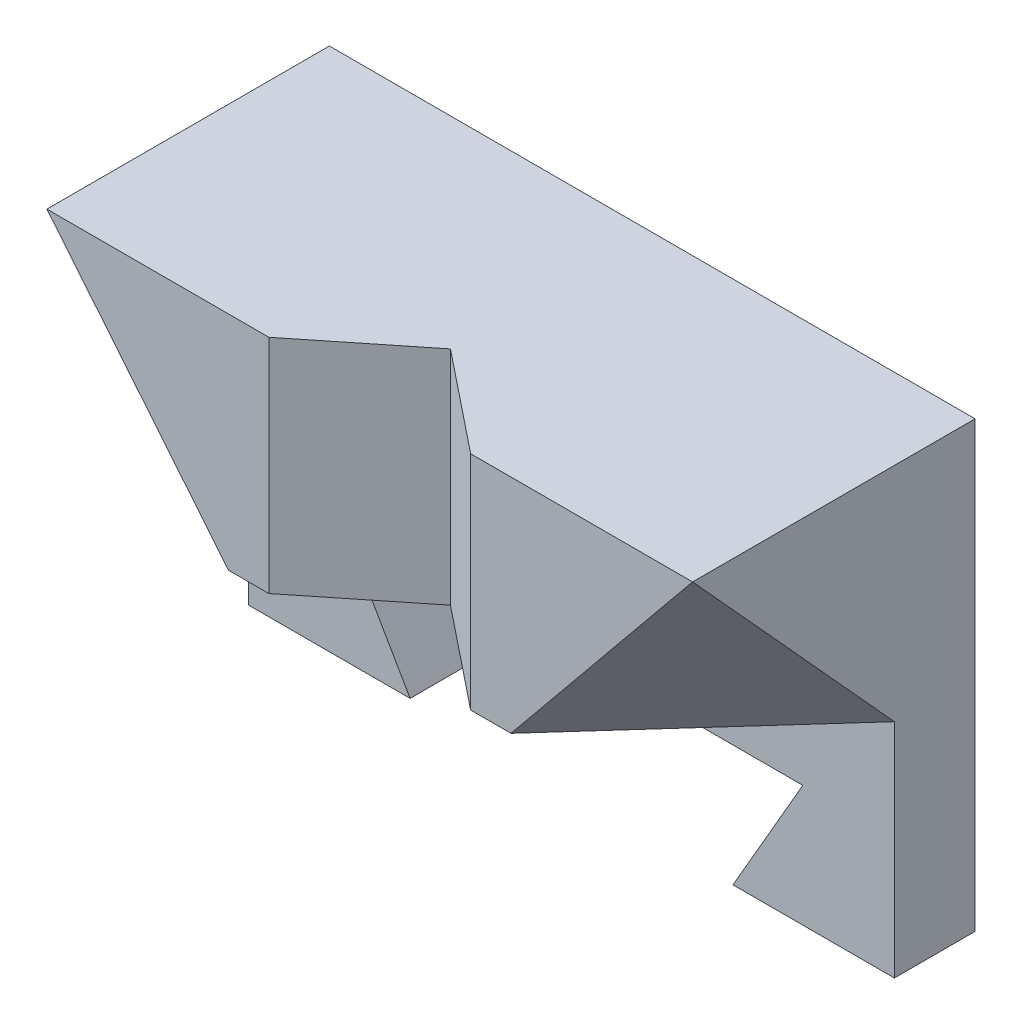
ISO-10303-21;
HEADER;
FILE_DESCRIPTION(('STEP AP214'),'2;1');
FILE_NAME('part.step','',(''),(''),'','','');
FILE_SCHEMA(('AUTOMOTIVE_DESIGN { 1 0 10303 214 1 1 1 1 }'));
ENDSEC;
DATA;
#1=APPLICATION_CONTEXT('core data for automotive mechanical design processes');
#2=APPLICATION_PROTOCOL_DEFINITION('international standard','automotive_design',2000,#1);
#3=PRODUCT_CONTEXT('',#1,'mechanical');
#4=PRODUCT('Part','Part','',(#3));
#5=PRODUCT_RELATED_PRODUCT_CATEGORY('part','',(#4));
#6=PRODUCT_DEFINITION_FORMATION('','',#4);
#7=PRODUCT_DEFINITION_CONTEXT('part definition',#1,'design');
#8=PRODUCT_DEFINITION('design','',#6,#7);
#9=PRODUCT_DEFINITION_SHAPE('','',#8);
#10=(LENGTH_UNIT() NAMED_UNIT(*) SI_UNIT(.MILLI.,.METRE.));
#11=(NAMED_UNIT(*) PLANE_ANGLE_UNIT() SI_UNIT($,.RADIAN.));
#12=(NAMED_UNIT(*) SI_UNIT($,.STERADIAN.) SOLID_ANGLE_UNIT());
#13=UNCERTAINTY_MEASURE_WITH_UNIT(LENGTH_MEASURE(1.E-05),#10,'distance_accuracy_value','');
#14=(GEOMETRIC_REPRESENTATION_CONTEXT(3) GLOBAL_UNCERTAINTY_ASSIGNED_CONTEXT((#13)) GLOBAL_UNIT_ASSIGNED_CONTEXT((#10,
#11,#12)) REPRESENTATION_CONTEXT('',''));
#15=CARTESIAN_POINT('',(0.,0.,0.));
#16=DIRECTION('',(0.,0.,1.));
#17=DIRECTION('',(1.,0.,0.));
#18=AXIS2_PLACEMENT_3D('',#15,#16,#17);
#19=CARTESIAN_POINT('',(0.,0.,20.));
#20=DIRECTION('',(0.,1.,0.));
#21=DIRECTION('',(-1.,0.,0.));
#22=AXIS2_PLACEMENT_3D('',#19,#20,#21);
#23=PLANE('',#22);
#24=DIRECTION('',(0.668964731622449,0.,-0.743294146247166));
#25=VECTOR('',#24,1.);
#26=CARTESIAN_POINT('',(7.73480662983426,0.,26.9613259668508));
#27=LINE('',#26,#25);
#28=CARTESIAN_POINT('',(14.,0.,20.));
#29=VERTEX_POINT('',#28);
#30=CARTESIAN_POINT('',(32.,0.,0.));
#31=VERTEX_POINT('',#30);
#32=EDGE_CURVE('E141',#29,#31,#27,.T.);
#33=ORIENTED_EDGE('',*,*,#32,.F.);
#34=DIRECTION('',(1.,0.,0.));
#35=VECTOR('',#34,1.);
#36=CARTESIAN_POINT('',(32.,0.,20.));
#37=LINE('',#36,#35);
#38=CARTESIAN_POINT('',(10.,0.,20.));
#39=VERTEX_POINT('',#38);
#40=EDGE_CURVE('E155',#39,#29,#37,.T.);
#41=ORIENTED_EDGE('',*,*,#40,.F.);
#42=DIRECTION('',(0.78086880944303,0.,0.624695047554424));
#43=VECTOR('',#42,1.);
#44=CARTESIAN_POINT('',(0.,0.,12.));
#45=LINE('',#44,#43);
#46=CARTESIAN_POINT('',(0.,0.,12.));
#47=VERTEX_POINT('',#46);
#48=EDGE_CURVE('E213',#47,#39,#45,.T.);
#49=ORIENTED_EDGE('',*,*,#48,.F.);
#50=DIRECTION('',(0.78086880944303,0.,-0.624695047554424));
#51=VECTOR('',#50,1.);
#52=CARTESIAN_POINT('',(-10.,0.,20.));
#53=LINE('',#52,#51);
#54=CARTESIAN_POINT('',(-10.,0.,20.));
#55=VERTEX_POINT('',#54);
#56=EDGE_CURVE('E220',#55,#47,#53,.T.);
#57=ORIENTED_EDGE('',*,*,#56,.F.);
#58=CARTESIAN_POINT('',(-14.,0.,20.));
#59=VERTEX_POINT('',#58);
#60=EDGE_CURVE('E178',#59,#55,#37,.T.);
#61=ORIENTED_EDGE('',*,*,#60,.F.);
#62=DIRECTION('',(0.66896473162245,0.,0.743294146247166));
#63=VECTOR('',#62,1.);
#64=CARTESIAN_POINT('',(-7.73480662983426,0.,26.9613259668508));
#65=LINE('',#64,#63);
#66=CARTESIAN_POINT('',(-32.,0.,0.));
#67=VERTEX_POINT('',#66);
#68=EDGE_CURVE('E55',#67,#59,#65,.T.);
#69=ORIENTED_EDGE('',*,*,#68,.F.);
#70=DIRECTION('',(1.,0.,0.));
#71=VECTOR('',#70,1.);
#72=CARTESIAN_POINT('',(0.,0.,0.));
#73=LINE('',#72,#71);
#74=EDGE_CURVE('E182',#67,#31,#73,.T.);
#75=ORIENTED_EDGE('',*,*,#74,.T.);
#76=EDGE_LOOP('',(#33,#41,#49,#57,#61,#69,#75));
#77=FACE_BOUND('',#76,.T.);
#78=ADVANCED_FACE('F41',(#77),#23,.F.);
#79=CARTESIAN_POINT('',(0.,0.,20.));
#80=DIRECTION('',(0.,0.,-1.));
#81=DIRECTION('',(-1.,0.,0.));
#82=AXIS2_PLACEMENT_3D('',#79,#80,#81);
#83=PLANE('',#82);
#84=DIRECTION('',(-0.633237790257263,-0.773957299203321,0.));
#85=VECTOR('',#84,1.);
#86=CARTESIAN_POINT('',(39.5817176996388,31.2665438551141,20.));
#87=LINE('',#86,#85);
#88=CARTESIAN_POINT('',(32.,22.,20.));
#89=VERTEX_POINT('',#88);
#90=EDGE_CURVE('E139',#89,#29,#87,.T.);
#91=ORIENTED_EDGE('',*,*,#90,.F.);
#92=DIRECTION('',(-1.,0.,0.));
#93=VECTOR('',#92,1.);
#94=CARTESIAN_POINT('',(-32.,22.,20.));
#95=LINE('',#94,#93);
#96=CARTESIAN_POINT('',(10.,22.,20.));
#97=VERTEX_POINT('',#96);
#98=EDGE_CURVE('E153',#89,#97,#95,.T.);
#99=ORIENTED_EDGE('',*,*,#98,.T.);
#100=DIRECTION('',(0.,-1.,0.));
#101=VECTOR('',#100,1.);
#102=CARTESIAN_POINT('',(10.,0.,20.));
#103=LINE('',#102,#101);
#104=EDGE_CURVE('E49',#97,#39,#103,.T.);
#105=ORIENTED_EDGE('',*,*,#104,.T.);
#106=ORIENTED_EDGE('',*,*,#40,.T.);
#107=EDGE_LOOP('',(#91,#99,#105,#106));
#108=FACE_BOUND('',#107,.T.);
#109=ADVANCED_FACE('F150',(#108),#83,.F.);
#110=CARTESIAN_POINT('',(32.,-22.,-8.));
#111=DIRECTION('',(1.,0.,0.));
#112=DIRECTION('',(0.,0.,-1.));
#113=AXIS2_PLACEMENT_3D('',#110,#111,#112);
#114=PLANE('',#113);
#115=DIRECTION('',(0.,0.,1.));
#116=VECTOR('',#115,1.);
#117=CARTESIAN_POINT('',(32.,22.,-8.));
#118=LINE('',#117,#116);
#119=CARTESIAN_POINT('',(32.,22.,-8.));
#120=VERTEX_POINT('',#119);
#121=EDGE_CURVE('E158',#120,#89,#118,.T.);
#122=ORIENTED_EDGE('',*,*,#121,.T.);
#123=DIRECTION('',(0.,-0.739940073395944,-0.672672793996313));
#124=VECTOR('',#123,1.);
#125=CARTESIAN_POINT('',(32.,-16.027149321267,-14.5701357466063));
#126=LINE('',#125,#124);
#127=EDGE_CURVE('E136',#89,#31,#126,.T.);
#128=ORIENTED_EDGE('',*,*,#127,.T.);
#129=DIRECTION('',(0.,1.,0.));
#130=VECTOR('',#129,1.);
#131=CARTESIAN_POINT('',(32.,-22.,0.));
#132=LINE('',#131,#130);
#133=CARTESIAN_POINT('',(32.,-22.,0.));
#134=VERTEX_POINT('',#133);
#135=EDGE_CURVE('E190',#134,#31,#132,.T.);
#136=ORIENTED_EDGE('',*,*,#135,.F.);
#137=DIRECTION('',(0.,0.,1.));
#138=VECTOR('',#137,1.);
#139=CARTESIAN_POINT('',(32.,-22.,-8.));
#140=LINE('',#139,#138);
#141=CARTESIAN_POINT('',(32.,-22.,-8.));
#142=VERTEX_POINT('',#141);
#143=EDGE_CURVE('E167',#142,#134,#140,.T.);
#144=ORIENTED_EDGE('',*,*,#143,.F.);
#145=DIRECTION('',(0.,1.,0.));
#146=VECTOR('',#145,1.);
#147=CARTESIAN_POINT('',(32.,-22.,-8.));
#148=LINE('',#147,#146);
#149=EDGE_CURVE('E162',#142,#120,#148,.T.);
#150=ORIENTED_EDGE('',*,*,#149,.T.);
#151=EDGE_LOOP('',(#122,#128,#136,#144,#150));
#152=FACE_BOUND('',#151,.T.);
#153=ADVANCED_FACE('F159',(#152),#114,.T.);
#154=CARTESIAN_POINT('',(-32.,-22.,-8.));
#155=DIRECTION('',(-1.,0.,0.));
#156=DIRECTION('',(0.,0.,1.));
#157=AXIS2_PLACEMENT_3D('',#154,#155,#156);
#158=PLANE('',#157);
#159=DIRECTION('',(0.,-1.,0.));
#160=VECTOR('',#159,1.);
#161=CARTESIAN_POINT('',(-32.,-22.,0.));
#162=LINE('',#161,#160);
#163=CARTESIAN_POINT('',(-32.,-22.,0.));
#164=VERTEX_POINT('',#163);
#165=EDGE_CURVE('E172',#67,#164,#162,.T.);
#166=ORIENTED_EDGE('',*,*,#165,.F.);
#167=DIRECTION('',(0.,0.739940073395944,0.672672793996313));
#168=VECTOR('',#167,1.);
#169=CARTESIAN_POINT('',(-32.,-16.027149321267,-14.5701357466063));
#170=LINE('',#169,#168);
#171=CARTESIAN_POINT('',(-32.,22.,20.));
#172=VERTEX_POINT('',#171);
#173=EDGE_CURVE('E221',#67,#172,#170,.T.);
#174=ORIENTED_EDGE('',*,*,#173,.T.);
#175=DIRECTION('',(0.,0.,1.));
#176=VECTOR('',#175,1.);
#177=CARTESIAN_POINT('',(-32.,22.,-8.));
#178=LINE('',#177,#176);
#179=CARTESIAN_POINT('',(-32.,22.,-8.));
#180=VERTEX_POINT('',#179);
#181=EDGE_CURVE('E166',#180,#172,#178,.T.);
#182=ORIENTED_EDGE('',*,*,#181,.F.);
#183=DIRECTION('',(0.,-1.,0.));
#184=VECTOR('',#183,1.);
#185=CARTESIAN_POINT('',(-32.,-22.,-8.));
#186=LINE('',#185,#184);
#187=CARTESIAN_POINT('',(-32.,-22.,-8.));
#188=VERTEX_POINT('',#187);
#189=EDGE_CURVE('E186',#180,#188,#186,.T.);
#190=ORIENTED_EDGE('',*,*,#189,.T.);
#191=DIRECTION('',(0.,0.,1.));
#192=VECTOR('',#191,1.);
#193=CARTESIAN_POINT('',(-32.,-22.,-8.));
#194=LINE('',#193,#192);
#195=EDGE_CURVE('E196',#188,#164,#194,.T.);
#196=ORIENTED_EDGE('',*,*,#195,.T.);
#197=EDGE_LOOP('',(#166,#174,#182,#190,#196));
#198=FACE_BOUND('',#197,.T.);
#199=ADVANCED_FACE('F43',(#198),#158,.T.);
#200=DIRECTION('',(-0.633237790257263,0.773957299203321,0.));
#201=VECTOR('',#200,1.);
#202=CARTESIAN_POINT('',(-8.38613861386139,-6.86138613861386,20.));
#203=LINE('',#202,#201);
#204=EDGE_CURVE('E11',#59,#172,#203,.T.);
#205=ORIENTED_EDGE('',*,*,#204,.F.);
#206=ORIENTED_EDGE('',*,*,#60,.T.);
#207=DIRECTION('',(0.,1.,0.));
#208=VECTOR('',#207,1.);
#209=CARTESIAN_POINT('',(-10.,0.,20.));
#210=LINE('',#209,#208);
#211=CARTESIAN_POINT('',(-10.,22.,20.));
#212=VERTEX_POINT('',#211);
#213=EDGE_CURVE('E203',#55,#212,#210,.T.);
#214=ORIENTED_EDGE('',*,*,#213,.T.);
#215=EDGE_CURVE('E173',#212,#172,#95,.T.);
#216=ORIENTED_EDGE('',*,*,#215,.T.);
#217=EDGE_LOOP('',(#205,#206,#214,#216));
#218=FACE_BOUND('',#217,.T.);
#219=ADVANCED_FACE('F216',(#218),#83,.F.);
#220=CARTESIAN_POINT('',(32.,-22.,-8.));
#221=DIRECTION('',(0.,-1.,0.));
#222=DIRECTION('',(1.,0.,0.));
#223=AXIS2_PLACEMENT_3D('',#220,#221,#222);
#224=PLANE('',#223);
#225=DIRECTION('',(0.,0.,1.));
#226=VECTOR('',#225,1.);
#227=CARTESIAN_POINT('',(-16.,-22.,-20.));
#228=LINE('',#227,#226);
#229=CARTESIAN_POINT('',(-16.,-22.,-8.));
#230=VERTEX_POINT('',#229);
#231=CARTESIAN_POINT('',(-16.,-22.,0.));
#232=VERTEX_POINT('',#231);
#233=EDGE_CURVE('E240',#230,#232,#228,.T.);
#234=ORIENTED_EDGE('',*,*,#233,.T.);
#235=DIRECTION('',(1.,0.,0.));
#236=VECTOR('',#235,1.);
#237=CARTESIAN_POINT('',(32.,-22.,0.));
#238=LINE('',#237,#236);
#239=EDGE_CURVE('E198',#164,#232,#238,.T.);
#240=ORIENTED_EDGE('',*,*,#239,.F.);
#241=ORIENTED_EDGE('',*,*,#195,.F.);
#242=DIRECTION('',(1.,0.,0.));
#243=VECTOR('',#242,1.);
#244=CARTESIAN_POINT('',(32.,-22.,-8.));
#245=LINE('',#244,#243);
#246=EDGE_CURVE('E191',#188,#230,#245,.T.);
#247=ORIENTED_EDGE('',*,*,#246,.T.);
#248=EDGE_LOOP('',(#234,#240,#241,#247));
#249=FACE_BOUND('',#248,.T.);
#250=ADVANCED_FACE('F262',(#249),#224,.T.);
#251=CARTESIAN_POINT('',(32.,22.,-8.));
#252=DIRECTION('',(0.,1.,0.));
#253=DIRECTION('',(-1.,0.,0.));
#254=AXIS2_PLACEMENT_3D('',#251,#252,#253);
#255=PLANE('',#254);
#256=DIRECTION('',(-0.78086880944303,0.,-0.624695047554424));
#257=VECTOR('',#256,1.);
#258=CARTESIAN_POINT('',(9.75609756097562,22.,19.8048780487805));
#259=LINE('',#258,#257);
#260=CARTESIAN_POINT('',(0.,22.,12.));
#261=VERTEX_POINT('',#260);
#262=EDGE_CURVE('E171',#97,#261,#259,.T.);
#263=ORIENTED_EDGE('',*,*,#262,.F.);
#264=ORIENTED_EDGE('',*,*,#98,.F.);
#265=ORIENTED_EDGE('',*,*,#121,.F.);
#266=DIRECTION('',(-1.,0.,0.));
#267=VECTOR('',#266,1.);
#268=CARTESIAN_POINT('',(32.,22.,-8.));
#269=LINE('',#268,#267);
#270=EDGE_CURVE('E195',#120,#180,#269,.T.);
#271=ORIENTED_EDGE('',*,*,#270,.T.);
#272=ORIENTED_EDGE('',*,*,#181,.T.);
#273=ORIENTED_EDGE('',*,*,#215,.F.);
#274=DIRECTION('',(-0.78086880944303,0.,0.624695047554424));
#275=VECTOR('',#274,1.);
#276=CARTESIAN_POINT('',(29.2682926829268,22.,-11.4146341463415));
#277=LINE('',#276,#275);
#278=EDGE_CURVE('E63',#261,#212,#277,.T.);
#279=ORIENTED_EDGE('',*,*,#278,.F.);
#280=EDGE_LOOP('',(#263,#264,#265,#271,#272,#273,#279));
#281=FACE_BOUND('',#280,.T.);
#282=ADVANCED_FACE('F170',(#281),#255,.T.);
#283=DIRECTION('',(0.,0.,1.));
#284=VECTOR('',#283,1.);
#285=CARTESIAN_POINT('',(16.,-22.,-20.));
#286=LINE('',#285,#284);
#287=CARTESIAN_POINT('',(16.,-22.,-8.));
#288=VERTEX_POINT('',#287);
#289=CARTESIAN_POINT('',(16.,-22.,0.));
#290=VERTEX_POINT('',#289);
#291=EDGE_CURVE('E239',#288,#290,#286,.T.);
#292=ORIENTED_EDGE('',*,*,#291,.F.);
#293=EDGE_CURVE('E189',#288,#142,#245,.T.);
#294=ORIENTED_EDGE('',*,*,#293,.T.);
#295=ORIENTED_EDGE('',*,*,#143,.T.);
#296=EDGE_CURVE('E175',#290,#134,#238,.T.);
#297=ORIENTED_EDGE('',*,*,#296,.F.);
#298=EDGE_LOOP('',(#292,#294,#295,#297));
#299=FACE_BOUND('',#298,.T.);
#300=ADVANCED_FACE('F269',(#299),#224,.T.);
#301=CARTESIAN_POINT('',(0.,0.,-8.));
#302=DIRECTION('',(0.,0.,1.));
#303=DIRECTION('',(1.,0.,0.));
#304=AXIS2_PLACEMENT_3D('',#301,#302,#303);
#305=PLANE('',#304);
#306=DIRECTION('',(-1.,0.,0.));
#307=VECTOR('',#306,1.);
#308=CARTESIAN_POINT('',(0.,-10.,-8.));
#309=LINE('',#308,#307);
#310=CARTESIAN_POINT('',(22.9282032302756,-10.,-8.));
#311=VERTEX_POINT('',#310);
#312=CARTESIAN_POINT('',(-22.9282032302756,-10.,-8.));
#313=VERTEX_POINT('',#312);
#314=EDGE_CURVE('E252',#311,#313,#309,.T.);
#315=ORIENTED_EDGE('',*,*,#314,.T.);
#316=DIRECTION('',(0.500000000000004,-0.866025403784436,0.));
#317=VECTOR('',#316,1.);
#318=CARTESIAN_POINT('',(-21.5262794416288,-12.4282032302756,-8.));
#319=LINE('',#318,#317);
#320=EDGE_CURVE('E185',#313,#230,#319,.T.);
#321=ORIENTED_EDGE('',*,*,#320,.T.);
#322=ORIENTED_EDGE('',*,*,#246,.F.);
#323=ORIENTED_EDGE('',*,*,#189,.F.);
#324=ORIENTED_EDGE('',*,*,#270,.F.);
#325=ORIENTED_EDGE('',*,*,#149,.F.);
#326=ORIENTED_EDGE('',*,*,#293,.F.);
#327=DIRECTION('',(0.500000000000005,0.866025403784436,0.));
#328=VECTOR('',#327,1.);
#329=CARTESIAN_POINT('',(21.5262794416288,-12.4282032302757,-8.));
#330=LINE('',#329,#328);
#331=EDGE_CURVE('E243',#288,#311,#330,.T.);
#332=ORIENTED_EDGE('',*,*,#331,.T.);
#333=EDGE_LOOP('',(#315,#321,#322,#323,#324,#325,#326,#332));
#334=FACE_BOUND('',#333,.T.);
#335=ADVANCED_FACE('F257',(#334),#305,.F.);
#336=CARTESIAN_POINT('',(0.,0.,0.));
#337=DIRECTION('',(0.,0.,1.));
#338=DIRECTION('',(1.,0.,0.));
#339=AXIS2_PLACEMENT_3D('',#336,#337,#338);
#340=PLANE('',#339);
#341=DIRECTION('',(-1.,0.,0.));
#342=VECTOR('',#341,1.);
#343=CARTESIAN_POINT('',(-22.9282032302756,-10.,0.));
#344=LINE('',#343,#342);
#345=CARTESIAN_POINT('',(22.9282032302756,-10.,0.));
#346=VERTEX_POINT('',#345);
#347=CARTESIAN_POINT('',(-22.9282032302756,-10.,0.));
#348=VERTEX_POINT('',#347);
#349=EDGE_CURVE('E234',#346,#348,#344,.T.);
#350=ORIENTED_EDGE('',*,*,#349,.F.);
#351=DIRECTION('',(0.500000000000005,0.866025403784436,0.));
#352=VECTOR('',#351,1.);
#353=CARTESIAN_POINT('',(22.9282032302756,-10.,0.));
#354=LINE('',#353,#352);
#355=EDGE_CURVE('E232',#290,#346,#354,.T.);
#356=ORIENTED_EDGE('',*,*,#355,.F.);
#357=ORIENTED_EDGE('',*,*,#296,.T.);
#358=ORIENTED_EDGE('',*,*,#135,.T.);
#359=ORIENTED_EDGE('',*,*,#74,.F.);
#360=ORIENTED_EDGE('',*,*,#165,.T.);
#361=ORIENTED_EDGE('',*,*,#239,.T.);
#362=DIRECTION('',(0.500000000000004,-0.866025403784436,0.));
#363=VECTOR('',#362,1.);
#364=CARTESIAN_POINT('',(-16.,-22.,0.));
#365=LINE('',#364,#363);
#366=EDGE_CURVE('E237',#348,#232,#365,.T.);
#367=ORIENTED_EDGE('',*,*,#366,.F.);
#368=EDGE_LOOP('',(#350,#356,#357,#358,#359,#360,#361,#367));
#369=FACE_BOUND('',#368,.T.);
#370=ADVANCED_FACE('F274',(#369),#340,.T.);
#371=CARTESIAN_POINT('',(-16.,-22.,-20.));
#372=DIRECTION('',(-0.866025403784436,-0.500000000000004,0.));
#373=DIRECTION('',(0.500000000000004,-0.866025403784436,0.));
#374=AXIS2_PLACEMENT_3D('',#371,#372,#373);
#375=PLANE('',#374);
#376=DIRECTION('',(0.,0.,1.));
#377=VECTOR('',#376,1.);
#378=CARTESIAN_POINT('',(-22.9282032302756,-10.,-20.));
#379=LINE('',#378,#377);
#380=EDGE_CURVE('E244',#313,#348,#379,.T.);
#381=ORIENTED_EDGE('',*,*,#380,.T.);
#382=ORIENTED_EDGE('',*,*,#366,.T.);
#383=ORIENTED_EDGE('',*,*,#233,.F.);
#384=ORIENTED_EDGE('',*,*,#320,.F.);
#385=EDGE_LOOP('',(#381,#382,#383,#384));
#386=FACE_BOUND('',#385,.T.);
#387=ADVANCED_FACE('F283',(#386),#375,.F.);
#388=CARTESIAN_POINT('',(-22.9282032302756,-10.,-20.));
#389=DIRECTION('',(0.,1.,0.));
#390=DIRECTION('',(0.,0.,1.));
#391=AXIS2_PLACEMENT_3D('',#388,#389,#390);
#392=PLANE('',#391);
#393=DIRECTION('',(0.,0.,1.));
#394=VECTOR('',#393,1.);
#395=CARTESIAN_POINT('',(22.9282032302756,-10.,-20.));
#396=LINE('',#395,#394);
#397=EDGE_CURVE('E246',#311,#346,#396,.T.);
#398=ORIENTED_EDGE('',*,*,#397,.T.);
#399=ORIENTED_EDGE('',*,*,#349,.T.);
#400=ORIENTED_EDGE('',*,*,#380,.F.);
#401=ORIENTED_EDGE('',*,*,#314,.F.);
#402=EDGE_LOOP('',(#398,#399,#400,#401));
#403=FACE_BOUND('',#402,.T.);
#404=ADVANCED_FACE('F282',(#403),#392,.F.);
#405=CARTESIAN_POINT('',(22.9282032302756,-10.,-20.));
#406=DIRECTION('',(0.866025403784436,-0.500000000000005,0.));
#407=DIRECTION('',(0.500000000000005,0.866025403784436,0.));
#408=AXIS2_PLACEMENT_3D('',#405,#406,#407);
#409=PLANE('',#408);
#410=ORIENTED_EDGE('',*,*,#291,.T.);
#411=ORIENTED_EDGE('',*,*,#355,.T.);
#412=ORIENTED_EDGE('',*,*,#397,.F.);
#413=ORIENTED_EDGE('',*,*,#331,.F.);
#414=EDGE_LOOP('',(#410,#411,#412,#413));
#415=FACE_BOUND('',#414,.T.);
#416=ADVANCED_FACE('F280',(#415),#409,.F.);
#417=CARTESIAN_POINT('',(0.,29.,12.));
#418=DIRECTION('',(0.624695047554424,0.,-0.78086880944303));
#419=DIRECTION('',(-0.78086880944303,0.,-0.624695047554424));
#420=AXIS2_PLACEMENT_3D('',#417,#418,#419);
#421=PLANE('',#420);
#422=ORIENTED_EDGE('',*,*,#262,.T.);
#423=DIRECTION('',(0.,-1.,0.));
#424=VECTOR('',#423,1.);
#425=CARTESIAN_POINT('',(0.,29.,12.));
#426=LINE('',#425,#424);
#427=EDGE_CURVE('E223',#261,#47,#426,.T.);
#428=ORIENTED_EDGE('',*,*,#427,.T.);
#429=ORIENTED_EDGE('',*,*,#48,.T.);
#430=ORIENTED_EDGE('',*,*,#104,.F.);
#431=EDGE_LOOP('',(#422,#428,#429,#430));
#432=FACE_BOUND('',#431,.T.);
#433=ADVANCED_FACE('F327',(#432),#421,.F.);
#434=CARTESIAN_POINT('',(-10.,29.,20.));
#435=DIRECTION('',(-0.624695047554424,0.,-0.78086880944303));
#436=DIRECTION('',(-0.78086880944303,0.,0.624695047554424));
#437=AXIS2_PLACEMENT_3D('',#434,#435,#436);
#438=PLANE('',#437);
#439=ORIENTED_EDGE('',*,*,#278,.T.);
#440=ORIENTED_EDGE('',*,*,#213,.F.);
#441=ORIENTED_EDGE('',*,*,#56,.T.);
#442=ORIENTED_EDGE('',*,*,#427,.F.);
#443=EDGE_LOOP('',(#439,#440,#441,#442));
#444=FACE_BOUND('',#443,.T.);
#445=ADVANCED_FACE('F219',(#444),#438,.F.);
#446=CARTESIAN_POINT('',(-50.3638959174606,22.4447616768963,0.));
#447=DIRECTION('',(-0.635074711618265,-0.519606582233126,0.571567240456438));
#448=DIRECTION('',(0.66896473162245,0.,0.743294146247166));
#449=AXIS2_PLACEMENT_3D('',#446,#447,#448);
#450=PLANE('',#449);
#451=ORIENTED_EDGE('',*,*,#68,.T.);
#452=ORIENTED_EDGE('',*,*,#204,.T.);
#453=ORIENTED_EDGE('',*,*,#173,.F.);
#454=EDGE_LOOP('',(#451,#452,#453));
#455=FACE_BOUND('',#454,.T.);
#456=ADVANCED_FACE('F326',(#455),#450,.T.);
#457=CARTESIAN_POINT('',(39.5817176996388,31.2665438551141,20.));
#458=DIRECTION('',(0.635074711618265,-0.519606582233126,0.571567240456438));
#459=DIRECTION('',(0.668964731622449,0.,-0.743294146247166));
#460=AXIS2_PLACEMENT_3D('',#457,#458,#459);
#461=PLANE('',#460);
#462=ORIENTED_EDGE('',*,*,#32,.T.);
#463=ORIENTED_EDGE('',*,*,#127,.F.);
#464=ORIENTED_EDGE('',*,*,#90,.T.);
#465=EDGE_LOOP('',(#462,#463,#464));
#466=FACE_BOUND('',#465,.T.);
#467=ADVANCED_FACE('F138',(#466),#461,.T.);
#468=CLOSED_SHELL('',(#78,#109,#153,#199,#219,#250,#282,#300,#335,#370,#387,#404,#416,#433,#445,
#456,#467));
#469=MANIFOLD_SOLID_BREP('B2',#468);
#470=ADVANCED_BREP_SHAPE_REPRESENTATION('',(#18,#469),#14);
#471=SHAPE_DEFINITION_REPRESENTATION(#9,#470);
ENDSEC;
END-ISO-10303-21;
